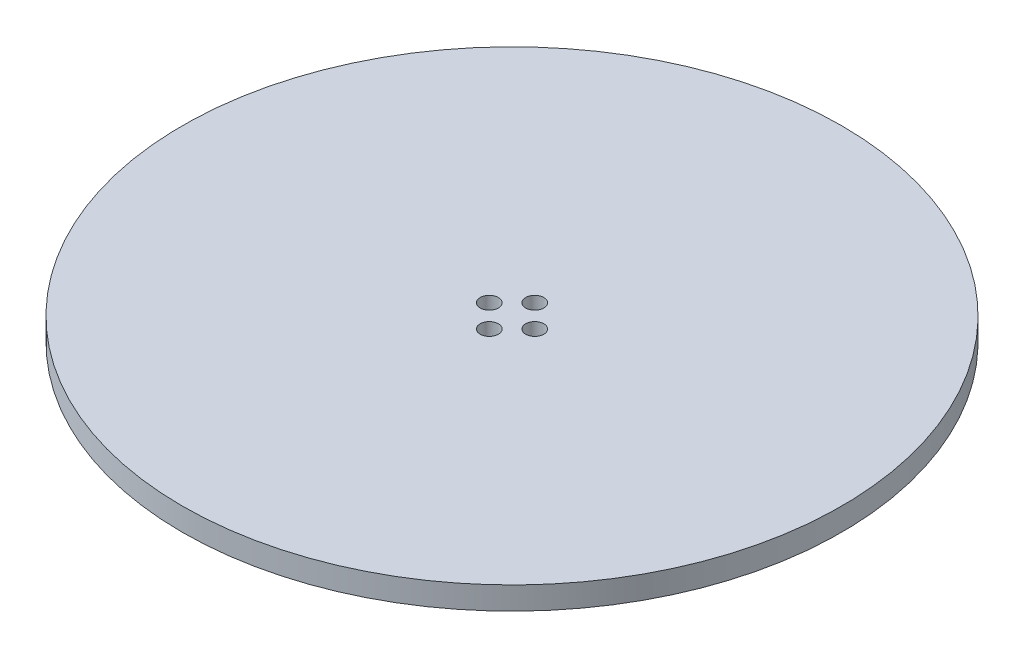
ISO-10303-21;
HEADER;
FILE_DESCRIPTION(('STEP AP214'),'2;1');
FILE_NAME('part.step','',(''),(''),'','','');
FILE_SCHEMA(('AUTOMOTIVE_DESIGN { 1 0 10303 214 1 1 1 1 }'));
ENDSEC;
DATA;
#1=APPLICATION_CONTEXT('core data for automotive mechanical design processes');
#2=APPLICATION_PROTOCOL_DEFINITION('international standard','automotive_design',2000,#1);
#3=PRODUCT_CONTEXT('',#1,'mechanical');
#4=PRODUCT('Part','Part','',(#3));
#5=PRODUCT_RELATED_PRODUCT_CATEGORY('part','',(#4));
#6=PRODUCT_DEFINITION_FORMATION('','',#4);
#7=PRODUCT_DEFINITION_CONTEXT('part definition',#1,'design');
#8=PRODUCT_DEFINITION('design','',#6,#7);
#9=PRODUCT_DEFINITION_SHAPE('','',#8);
#10=(LENGTH_UNIT() NAMED_UNIT(*) SI_UNIT(.MILLI.,.METRE.));
#11=(NAMED_UNIT(*) PLANE_ANGLE_UNIT() SI_UNIT($,.RADIAN.));
#12=(NAMED_UNIT(*) SI_UNIT($,.STERADIAN.) SOLID_ANGLE_UNIT());
#13=UNCERTAINTY_MEASURE_WITH_UNIT(LENGTH_MEASURE(1.E-05),#10,'distance_accuracy_value','');
#14=(GEOMETRIC_REPRESENTATION_CONTEXT(3) GLOBAL_UNCERTAINTY_ASSIGNED_CONTEXT((#13)) GLOBAL_UNIT_ASSIGNED_CONTEXT((#10,
#11,#12)) REPRESENTATION_CONTEXT('',''));
#15=CARTESIAN_POINT('',(0.,0.,0.));
#16=DIRECTION('',(0.,0.,1.));
#17=DIRECTION('',(1.,0.,0.));
#18=AXIS2_PLACEMENT_3D('',#15,#16,#17);
#19=CARTESIAN_POINT('',(-5.,5.,0.));
#20=DIRECTION('',(0.,-1.,0.));
#21=DIRECTION('',(0.,0.,-1.));
#22=AXIS2_PLACEMENT_3D('',#19,#20,#21);
#23=CYLINDRICAL_SURFACE('',#22,2.);
#24=CARTESIAN_POINT('',(-5.,5.,0.));
#25=DIRECTION('',(0.,1.,0.));
#26=DIRECTION('',(0.,0.,1.));
#27=AXIS2_PLACEMENT_3D('',#24,#25,#26);
#28=CIRCLE('',#27,2.);
#29=CARTESIAN_POINT('',(-5.,5.,2.));
#30=VERTEX_POINT('',#29);
#31=EDGE_CURVE('E41',#30,#30,#28,.T.);
#32=ORIENTED_EDGE('',*,*,#31,.T.);
#33=EDGE_LOOP('',(#32));
#34=FACE_BOUND('',#33,.T.);
#35=CARTESIAN_POINT('',(-5.,0.,0.));
#36=DIRECTION('',(0.,1.,0.));
#37=DIRECTION('',(0.,0.,1.));
#38=AXIS2_PLACEMENT_3D('',#35,#36,#37);
#39=CIRCLE('',#38,2.);
#40=CARTESIAN_POINT('',(-5.,0.,2.));
#41=VERTEX_POINT('',#40);
#42=EDGE_CURVE('E58',#41,#41,#39,.T.);
#43=ORIENTED_EDGE('',*,*,#42,.F.);
#44=EDGE_LOOP('',(#43));
#45=FACE_BOUND('',#44,.T.);
#46=ADVANCED_FACE('F33',(#34,#45),#23,.F.);
#47=CARTESIAN_POINT('',(0.,5.,0.));
#48=DIRECTION('',(0.,-1.,0.));
#49=DIRECTION('',(0.,0.,-1.));
#50=AXIS2_PLACEMENT_3D('',#47,#48,#49);
#51=CYLINDRICAL_SURFACE('',#50,72.5);
#52=CARTESIAN_POINT('',(0.,5.,0.));
#53=DIRECTION('',(0.,1.,0.));
#54=DIRECTION('',(0.,0.,1.));
#55=AXIS2_PLACEMENT_3D('',#52,#53,#54);
#56=CIRCLE('',#55,72.5);
#57=CARTESIAN_POINT('',(0.,5.,72.5));
#58=VERTEX_POINT('',#57);
#59=EDGE_CURVE('E46',#58,#58,#56,.T.);
#60=ORIENTED_EDGE('',*,*,#59,.F.);
#61=EDGE_LOOP('',(#60));
#62=FACE_BOUND('',#61,.T.);
#63=CARTESIAN_POINT('',(0.,0.,0.));
#64=DIRECTION('',(0.,1.,0.));
#65=DIRECTION('',(0.,0.,1.));
#66=AXIS2_PLACEMENT_3D('',#63,#64,#65);
#67=CIRCLE('',#66,72.5);
#68=CARTESIAN_POINT('',(0.,0.,72.5));
#69=VERTEX_POINT('',#68);
#70=EDGE_CURVE('E56',#69,#69,#67,.T.);
#71=ORIENTED_EDGE('',*,*,#70,.T.);
#72=EDGE_LOOP('',(#71));
#73=FACE_BOUND('',#72,.T.);
#74=ADVANCED_FACE('F79',(#62,#73),#51,.T.);
#75=CARTESIAN_POINT('',(0.,5.,5.));
#76=DIRECTION('',(0.,-1.,0.));
#77=DIRECTION('',(0.,0.,-1.));
#78=AXIS2_PLACEMENT_3D('',#75,#76,#77);
#79=CYLINDRICAL_SURFACE('',#78,2.);
#80=CARTESIAN_POINT('',(0.,5.,5.));
#81=DIRECTION('',(0.,1.,0.));
#82=DIRECTION('',(0.,0.,1.));
#83=AXIS2_PLACEMENT_3D('',#80,#81,#82);
#84=CIRCLE('',#83,2.);
#85=CARTESIAN_POINT('',(0.,5.,7.));
#86=VERTEX_POINT('',#85);
#87=EDGE_CURVE('E67',#86,#86,#84,.T.);
#88=ORIENTED_EDGE('',*,*,#87,.T.);
#89=EDGE_LOOP('',(#88));
#90=FACE_BOUND('',#89,.T.);
#91=CARTESIAN_POINT('',(0.,0.,5.));
#92=DIRECTION('',(0.,1.,0.));
#93=DIRECTION('',(0.,0.,1.));
#94=AXIS2_PLACEMENT_3D('',#91,#92,#93);
#95=CIRCLE('',#94,2.);
#96=CARTESIAN_POINT('',(0.,0.,7.));
#97=VERTEX_POINT('',#96);
#98=EDGE_CURVE('E53',#97,#97,#95,.T.);
#99=ORIENTED_EDGE('',*,*,#98,.F.);
#100=EDGE_LOOP('',(#99));
#101=FACE_BOUND('',#100,.T.);
#102=ADVANCED_FACE('F82',(#90,#101),#79,.F.);
#103=CARTESIAN_POINT('',(0.,5.,-5.));
#104=DIRECTION('',(0.,-1.,0.));
#105=DIRECTION('',(0.,0.,-1.));
#106=AXIS2_PLACEMENT_3D('',#103,#104,#105);
#107=CYLINDRICAL_SURFACE('',#106,2.);
#108=CARTESIAN_POINT('',(0.,5.,-5.));
#109=DIRECTION('',(0.,1.,0.));
#110=DIRECTION('',(0.,0.,1.));
#111=AXIS2_PLACEMENT_3D('',#108,#109,#110);
#112=CIRCLE('',#111,2.);
#113=CARTESIAN_POINT('',(0.,5.,-3.));
#114=VERTEX_POINT('',#113);
#115=EDGE_CURVE('E63',#114,#114,#112,.T.);
#116=ORIENTED_EDGE('',*,*,#115,.T.);
#117=EDGE_LOOP('',(#116));
#118=FACE_BOUND('',#117,.T.);
#119=CARTESIAN_POINT('',(0.,0.,-5.));
#120=DIRECTION('',(0.,1.,0.));
#121=DIRECTION('',(0.,0.,1.));
#122=AXIS2_PLACEMENT_3D('',#119,#120,#121);
#123=CIRCLE('',#122,2.);
#124=CARTESIAN_POINT('',(0.,0.,-3.));
#125=VERTEX_POINT('',#124);
#126=EDGE_CURVE('E50',#125,#125,#123,.T.);
#127=ORIENTED_EDGE('',*,*,#126,.F.);
#128=EDGE_LOOP('',(#127));
#129=FACE_BOUND('',#128,.T.);
#130=ADVANCED_FACE('F35',(#118,#129),#107,.F.);
#131=CARTESIAN_POINT('',(5.,5.,0.));
#132=DIRECTION('',(0.,-1.,0.));
#133=DIRECTION('',(0.,0.,-1.));
#134=AXIS2_PLACEMENT_3D('',#131,#132,#133);
#135=CYLINDRICAL_SURFACE('',#134,2.);
#136=CARTESIAN_POINT('',(5.,5.,0.));
#137=DIRECTION('',(0.,1.,0.));
#138=DIRECTION('',(0.,0.,1.));
#139=AXIS2_PLACEMENT_3D('',#136,#137,#138);
#140=CIRCLE('',#139,2.);
#141=CARTESIAN_POINT('',(5.,5.,2.));
#142=VERTEX_POINT('',#141);
#143=EDGE_CURVE('E10',#142,#142,#140,.F.);
#144=ORIENTED_EDGE('',*,*,#143,.F.);
#145=EDGE_LOOP('',(#144));
#146=FACE_BOUND('',#145,.T.);
#147=CARTESIAN_POINT('',(5.,0.,0.));
#148=DIRECTION('',(0.,1.,0.));
#149=DIRECTION('',(0.,0.,1.));
#150=AXIS2_PLACEMENT_3D('',#147,#148,#149);
#151=CIRCLE('',#150,2.);
#152=CARTESIAN_POINT('',(5.,0.,2.));
#153=VERTEX_POINT('',#152);
#154=EDGE_CURVE('E37',#153,#153,#151,.F.);
#155=ORIENTED_EDGE('',*,*,#154,.T.);
#156=EDGE_LOOP('',(#155));
#157=FACE_BOUND('',#156,.T.);
#158=ADVANCED_FACE('F94',(#146,#157),#135,.F.);
#159=CARTESIAN_POINT('',(0.,5.,0.));
#160=DIRECTION('',(0.,1.,0.));
#161=DIRECTION('',(0.,0.,1.));
#162=AXIS2_PLACEMENT_3D('',#159,#160,#161);
#163=PLANE('',#162);
#164=ORIENTED_EDGE('',*,*,#115,.F.);
#165=EDGE_LOOP('',(#164));
#166=FACE_BOUND('',#165,.T.);
#167=ORIENTED_EDGE('',*,*,#87,.F.);
#168=EDGE_LOOP('',(#167));
#169=FACE_BOUND('',#168,.T.);
#170=ORIENTED_EDGE('',*,*,#59,.T.);
#171=EDGE_LOOP('',(#170));
#172=FACE_BOUND('',#171,.T.);
#173=ORIENTED_EDGE('',*,*,#31,.F.);
#174=EDGE_LOOP('',(#173));
#175=FACE_BOUND('',#174,.T.);
#176=ORIENTED_EDGE('',*,*,#143,.T.);
#177=EDGE_LOOP('',(#176));
#178=FACE_BOUND('',#177,.T.);
#179=ADVANCED_FACE('F76',(#166,#169,#172,#175,#178),#163,.T.);
#180=CARTESIAN_POINT('',(0.,0.,0.));
#181=DIRECTION('',(0.,1.,0.));
#182=DIRECTION('',(0.,0.,1.));
#183=AXIS2_PLACEMENT_3D('',#180,#181,#182);
#184=PLANE('',#183);
#185=ORIENTED_EDGE('',*,*,#126,.T.);
#186=EDGE_LOOP('',(#185));
#187=FACE_BOUND('',#186,.T.);
#188=ORIENTED_EDGE('',*,*,#98,.T.);
#189=EDGE_LOOP('',(#188));
#190=FACE_BOUND('',#189,.T.);
#191=ORIENTED_EDGE('',*,*,#70,.F.);
#192=EDGE_LOOP('',(#191));
#193=FACE_BOUND('',#192,.T.);
#194=ORIENTED_EDGE('',*,*,#42,.T.);
#195=EDGE_LOOP('',(#194));
#196=FACE_BOUND('',#195,.T.);
#197=ORIENTED_EDGE('',*,*,#154,.F.);
#198=EDGE_LOOP('',(#197));
#199=FACE_BOUND('',#198,.T.);
#200=ADVANCED_FACE('F86',(#187,#190,#193,#196,#199),#184,.F.);
#201=CLOSED_SHELL('',(#46,#74,#102,#130,#158,#179,#200));
#202=MANIFOLD_SOLID_BREP('B2',#201);
#203=ADVANCED_BREP_SHAPE_REPRESENTATION('',(#18,#202),#14);
#204=SHAPE_DEFINITION_REPRESENTATION(#9,#203);
ENDSEC;
END-ISO-10303-21;
